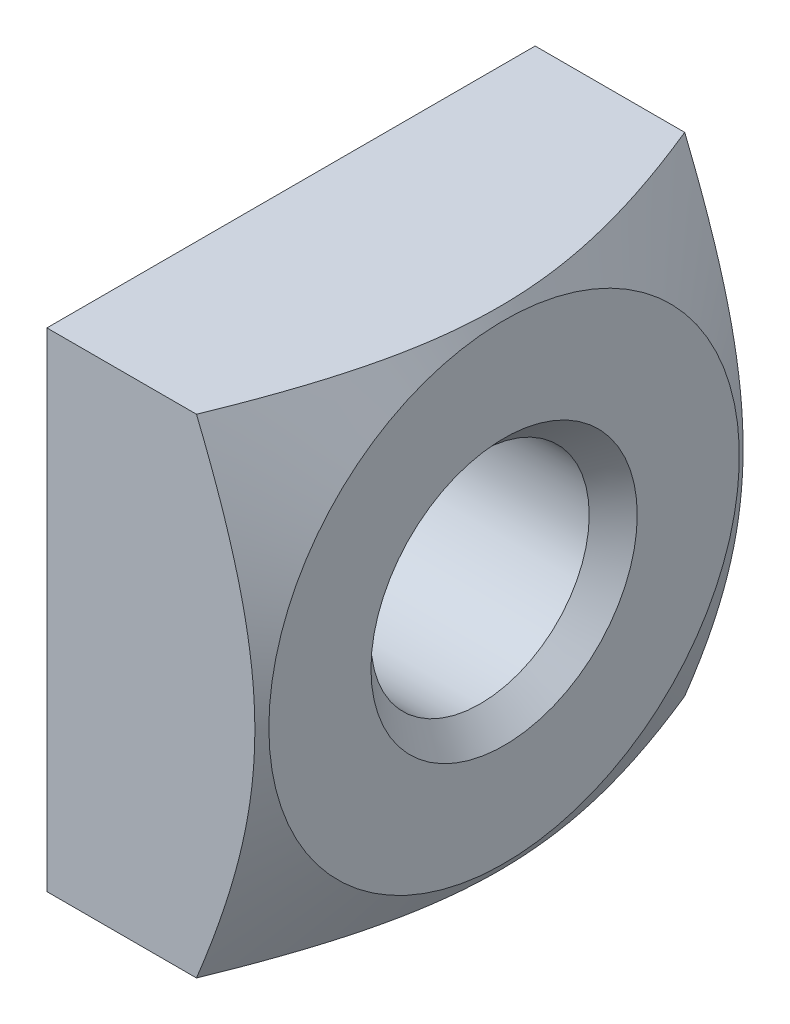
ISO-10303-21;
HEADER;
FILE_DESCRIPTION(('STEP AP214'),'2;1');
FILE_NAME('part.step','',(''),(''),'','','');
FILE_SCHEMA(('AUTOMOTIVE_DESIGN { 1 0 10303 214 1 1 1 1 }'));
ENDSEC;
DATA;
#1=APPLICATION_CONTEXT('core data for automotive mechanical design processes');
#2=APPLICATION_PROTOCOL_DEFINITION('international standard','automotive_design',2000,#1);
#3=PRODUCT_CONTEXT('',#1,'mechanical');
#4=PRODUCT('Part','Part','',(#3));
#5=PRODUCT_RELATED_PRODUCT_CATEGORY('part','',(#4));
#6=PRODUCT_DEFINITION_FORMATION('','',#4);
#7=PRODUCT_DEFINITION_CONTEXT('part definition',#1,'design');
#8=PRODUCT_DEFINITION('design','',#6,#7);
#9=PRODUCT_DEFINITION_SHAPE('','',#8);
#10=(LENGTH_UNIT() NAMED_UNIT(*) SI_UNIT(.MILLI.,.METRE.));
#11=(NAMED_UNIT(*) PLANE_ANGLE_UNIT() SI_UNIT($,.RADIAN.));
#12=(NAMED_UNIT(*) SI_UNIT($,.STERADIAN.) SOLID_ANGLE_UNIT());
#13=UNCERTAINTY_MEASURE_WITH_UNIT(LENGTH_MEASURE(1.E-05),#10,'distance_accuracy_value','');
#14=(GEOMETRIC_REPRESENTATION_CONTEXT(3) GLOBAL_UNCERTAINTY_ASSIGNED_CONTEXT((#13)) GLOBAL_UNIT_ASSIGNED_CONTEXT((#10,
#11,#12)) REPRESENTATION_CONTEXT('',''));
#15=CARTESIAN_POINT('',(0.,0.,0.));
#16=DIRECTION('',(0.,0.,1.));
#17=DIRECTION('',(1.,0.,0.));
#18=AXIS2_PLACEMENT_3D('',#15,#16,#17);
#19=CARTESIAN_POINT('',(2.4,2.65,0.));
#20=DIRECTION('',(-1.,0.,0.));
#21=DIRECTION('',(0.,0.,1.));
#22=AXIS2_PLACEMENT_3D('',#19,#20,#21);
#23=PLANE('',#22);
#24=CARTESIAN_POINT('',(2.4,0.,0.));
#25=DIRECTION('',(-1.,0.,0.));
#26=DIRECTION('',(0.,0.,1.));
#27=AXIS2_PLACEMENT_3D('',#24,#25,#26);
#28=CIRCLE('',#27,2.65);
#29=CARTESIAN_POINT('',(2.4,0.,2.65));
#30=VERTEX_POINT('',#29);
#31=EDGE_CURVE('E87',#30,#30,#28,.T.);
#32=ORIENTED_EDGE('',*,*,#31,.F.);
#33=EDGE_LOOP('',(#32));
#34=FACE_BOUND('',#33,.T.);
#35=CARTESIAN_POINT('',(2.4,0.,0.));
#36=DIRECTION('',(-1.,0.,0.));
#37=DIRECTION('',(0.,0.,1.));
#38=AXIS2_PLACEMENT_3D('',#35,#36,#37);
#39=CIRCLE('',#38,1.5);
#40=CARTESIAN_POINT('',(2.4,0.,1.5));
#41=VERTEX_POINT('',#40);
#42=EDGE_CURVE('E151',#41,#41,#39,.T.);
#43=ORIENTED_EDGE('',*,*,#42,.T.);
#44=EDGE_LOOP('',(#43));
#45=FACE_BOUND('',#44,.T.);
#46=ADVANCED_FACE('F33',(#34,#45),#23,.F.);
#47=CARTESIAN_POINT('',(0.,0.,0.));
#48=DIRECTION('',(1.,0.,0.));
#49=DIRECTION('',(0.,0.,-1.));
#50=AXIS2_PLACEMENT_3D('',#47,#48,#49);
#51=PLANE('',#50);
#52=DIRECTION('',(0.,-1.,0.));
#53=VECTOR('',#52,1.);
#54=CARTESIAN_POINT('',(0.,2.75,2.75));
#55=LINE('',#54,#53);
#56=CARTESIAN_POINT('',(0.,2.75,2.75));
#57=VERTEX_POINT('',#56);
#58=CARTESIAN_POINT('',(0.,-2.75,2.75));
#59=VERTEX_POINT('',#58);
#60=EDGE_CURVE('E84',#57,#59,#55,.T.);
#61=ORIENTED_EDGE('',*,*,#60,.F.);
#62=DIRECTION('',(0.,0.,1.));
#63=VECTOR('',#62,1.);
#64=CARTESIAN_POINT('',(0.,2.75,-2.75));
#65=LINE('',#64,#63);
#66=CARTESIAN_POINT('',(0.,2.75,-2.75));
#67=VERTEX_POINT('',#66);
#68=EDGE_CURVE('E91',#67,#57,#65,.T.);
#69=ORIENTED_EDGE('',*,*,#68,.F.);
#70=DIRECTION('',(0.,1.,0.));
#71=VECTOR('',#70,1.);
#72=CARTESIAN_POINT('',(0.,-2.75,-2.75));
#73=LINE('',#72,#71);
#74=CARTESIAN_POINT('',(0.,-2.75,-2.75));
#75=VERTEX_POINT('',#74);
#76=EDGE_CURVE('E99',#75,#67,#73,.T.);
#77=ORIENTED_EDGE('',*,*,#76,.F.);
#78=DIRECTION('',(0.,0.,-1.));
#79=VECTOR('',#78,1.);
#80=CARTESIAN_POINT('',(0.,-2.75,2.75));
#81=LINE('',#80,#79);
#82=EDGE_CURVE('E52',#59,#75,#81,.T.);
#83=ORIENTED_EDGE('',*,*,#82,.F.);
#84=EDGE_LOOP('',(#61,#69,#77,#83));
#85=FACE_BOUND('',#84,.T.);
#86=CARTESIAN_POINT('',(0.,0.,0.));
#87=DIRECTION('',(-1.,0.,0.));
#88=DIRECTION('',(0.,0.,1.));
#89=AXIS2_PLACEMENT_3D('',#86,#87,#88);
#90=CIRCLE('',#89,1.5);
#91=CARTESIAN_POINT('',(0.,0.,1.5));
#92=VERTEX_POINT('',#91);
#93=EDGE_CURVE('E95',#92,#92,#90,.T.);
#94=ORIENTED_EDGE('',*,*,#93,.F.);
#95=EDGE_LOOP('',(#94));
#96=FACE_BOUND('',#95,.T.);
#97=ADVANCED_FACE('F35',(#85,#96),#51,.F.);
#98=CARTESIAN_POINT('',(2.4,0.,0.));
#99=DIRECTION('',(-1.,0.,0.));
#100=DIRECTION('',(0.,0.,1.));
#101=AXIS2_PLACEMENT_3D('',#98,#99,#100);
#102=CONICAL_SURFACE('',#101,2.65,1.04719755119662);
#103=CARTESIAN_POINT('',(0.437416403055454,-5.38808537388172,-2.75));
#104=CARTESIAN_POINT('',(0.505632143891159,-5.25541159197081,-2.75));
#105=CARTESIAN_POINT('',(0.573453461779533,-5.12253295749888,-2.75));
#106=CARTESIAN_POINT('',(0.708096214056448,-4.85625986272506,-2.75));
#107=CARTESIAN_POINT('',(0.774917585008944,-4.72286537036732,-2.75));
#108=CARTESIAN_POINT('',(0.907500859792786,-4.45514784192819,-2.75));
#109=CARTESIAN_POINT('',(0.973259810571052,-4.32082334043091,-2.75));
#110=CARTESIAN_POINT('',(1.10324958936328,-4.05143910973717,-2.75));
#111=CARTESIAN_POINT('',(1.16748044967093,-3.91637939615247,-2.75));
#112=CARTESIAN_POINT('',(1.29750550621058,-3.63790013300568,-2.75));
#113=CARTESIAN_POINT('',(1.36319109035207,-3.49442969921591,-2.75));
#114=CARTESIAN_POINT('',(1.49179514662202,-3.20625532550067,-2.75));
#115=CARTESIAN_POINT('',(1.55471372276137,-3.06155143218505,-2.75));
#116=CARTESIAN_POINT('',(1.67686851691062,-2.77073309783559,-2.75));
#117=CARTESIAN_POINT('',(1.73610784288296,-2.62461997117271,-2.75));
#118=CARTESIAN_POINT('',(1.84975693489482,-2.33053676406858,-2.75));
#119=CARTESIAN_POINT('',(1.90416735328264,-2.18256693754529,-2.75));
#120=CARTESIAN_POINT('',(2.00596545645127,-1.88601039374014,-2.75));
#121=CARTESIAN_POINT('',(2.05342386975733,-1.73744840791392,-2.75));
#122=CARTESIAN_POINT('',(2.11827419079946,-1.51278051179147,-2.75));
#123=CARTESIAN_POINT('',(2.13883441206025,-1.43758853019003,-2.75));
#124=CARTESIAN_POINT('',(2.17753756373119,-1.28655762717232,-2.75));
#125=CARTESIAN_POINT('',(2.19567963950927,-1.21071848705717,-2.75));
#126=CARTESIAN_POINT('',(2.24533241429907,-0.985210508325254,-2.75));
#127=CARTESIAN_POINT('',(2.27293118185924,-0.834645726610996,-2.75));
#128=CARTESIAN_POINT('',(2.31507962935898,-0.53169406208772,-2.75));
#129=CARTESIAN_POINT('',(2.32963462910368,-0.379307947815045,-2.75));
#130=CARTESIAN_POINT('',(2.34123496030579,-0.13494690316544,-2.75));
#131=CARTESIAN_POINT('',(2.34295425314226,-0.0431776929021778,-2.75));
#132=CARTESIAN_POINT('',(2.34108060400825,0.14030364395211,-2.75));
#133=CARTESIAN_POINT('',(2.33748809855552,0.232015774614266,-2.75));
#134=CARTESIAN_POINT('',(2.32513752294774,0.415110830618787,-2.75));
#135=CARTESIAN_POINT('',(2.31637804124029,0.506493659133811,-2.75));
#136=CARTESIAN_POINT('',(2.29404456762574,0.688667459824817,-2.75));
#137=CARTESIAN_POINT('',(2.28047030004528,0.77945839780858,-2.75));
#138=CARTESIAN_POINT('',(2.24856054899789,0.962724508580117,-2.75));
#139=CARTESIAN_POINT('',(2.23010616720754,1.05517877608576,-2.75));
#140=CARTESIAN_POINT('',(2.18920401152235,1.23919255640873,-2.75));
#141=CARTESIAN_POINT('',(2.16675617303849,1.33075205472906,-2.75));
#142=CARTESIAN_POINT('',(2.11843300976784,1.51299240426342,-2.75));
#143=CARTESIAN_POINT('',(2.09255639480035,1.60367291087832,-2.75));
#144=CARTESIAN_POINT('',(2.0379088684679,1.78414541620499,-2.75));
#145=CARTESIAN_POINT('',(2.00913812154588,1.87393746508036,-2.75));
#146=CARTESIAN_POINT('',(1.92235698964403,2.13264631611484,-2.75));
#147=CARTESIAN_POINT('',(1.8612080357348,2.30050975377942,-2.75));
#148=CARTESIAN_POINT('',(1.73268409429066,2.63385076598241,-2.75));
#149=CARTESIAN_POINT('',(1.66530727663687,2.79932762258047,-2.75));
#150=CARTESIAN_POINT('',(1.52597938856516,3.12852460374905,-2.75));
#151=CARTESIAN_POINT('',(1.45402390241538,3.29224284888837,-2.75));
#152=CARTESIAN_POINT('',(1.30679720906668,3.61815098161288,-2.75));
#153=CARTESIAN_POINT('',(1.23152636886425,3.78034103596192,-2.75));
#154=CARTESIAN_POINT('',(1.07822784592911,4.10408880143019,-2.75));
#155=CARTESIAN_POINT('',(1.00019161157938,4.26564245008812,-2.75));
#156=CARTESIAN_POINT('',(0.842191787436758,4.58780633721145,-2.75));
#157=CARTESIAN_POINT('',(0.762228154206207,4.74841655431316,-2.75));
#158=CARTESIAN_POINT('',(0.520205449189572,5.22894464165323,-2.75));
#159=CARTESIAN_POINT('',(0.35592644903869,5.54774327678589,-2.75));
#160=CARTESIAN_POINT('',(0.04598624414216,6.14061157619431,-2.75));
#161=CARTESIAN_POINT('',(-0.0992059455244494,6.41492811784777,-2.75));
#162=CARTESIAN_POINT('',(-0.391616188124209,6.9625345600643,-2.75));
#163=CARTESIAN_POINT('',(-0.538834556964888,7.23582429188167,-2.75));
#164=CARTESIAN_POINT('',(-0.833704642081305,7.77973186206536,-2.75));
#165=CARTESIAN_POINT('',(-0.981346366331184,8.05035512835453,-2.75));
#166=CARTESIAN_POINT('',(-1.2777055138227,8.59094852922867,-2.75));
#167=CARTESIAN_POINT('',(-1.4264227372717,8.86091877328955,-2.75));
#168=CARTESIAN_POINT('',(-1.57552552771281,9.1306743633019,-2.75));
#169=B_SPLINE_CURVE_WITH_KNOTS('',3,(#103,#104,#105,#106,#107,#108,#109,#110,#111,#112,#113,
#114,#115,#116,#117,#118,#119,#120,#121,#122,#123,#124,#125,#126,#127,#128,#129,#130,#131,#132,
#133,#134,#135,#136,#137,#138,#139,#140,#141,#142,#143,#144,#145,#146,#147,#148,#149,#150,#151,
#152,#153,#154,#155,#156,#157,#158,#159,#160,#161,#162,#163,#164,#165,#166,#167,#168),
.UNSPECIFIED.,.F.,.F.,(4,2,2,2,2,2,2,2,2,2,2,2,2,2,2,2,2,2,2,2,2,2,2,2,2,2,2,2,2,2,2,2,4),(0.,
0.447552594613201,0.895133462351489,1.34379676691492,1.792450581277,2.2658045758501,
2.73914076197237,3.21207151191024,3.68493827497786,4.15259846123942,4.38641952174626,
4.62032300247546,5.07905765833717,5.53760513737404,5.81282004389318,6.08801233481039,
6.36327983961322,6.63856310756212,6.92129550601798,7.20403247772209,7.48687614147976,
7.76970374328904,8.30546900140096,8.84139220297657,9.37784032853619,9.91422921993717,
10.4524534258937,10.9906897731385,12.0665523531479,12.9976584090078,13.9289113189696,
14.8537412810219,15.77840364063),.UNSPECIFIED.);
#170=CARTESIAN_POINT('',(1.68461261580129,-2.75,-2.75));
#171=VERTEX_POINT('',#170);
#172=CARTESIAN_POINT('',(1.68461261580129,2.75,-2.75));
#173=VERTEX_POINT('',#172);
#174=EDGE_CURVE('E110',#171,#173,#169,.T.);
#175=ORIENTED_EDGE('',*,*,#174,.T.);
#176=CARTESIAN_POINT('',(0.437416403055454,2.75,-5.38808537388172));
#177=CARTESIAN_POINT('',(0.505632143891159,2.75,-5.25541159197081));
#178=CARTESIAN_POINT('',(0.573453461779533,2.75,-5.12253295749888));
#179=CARTESIAN_POINT('',(0.708096214056448,2.75,-4.85625986272506));
#180=CARTESIAN_POINT('',(0.774917585008944,2.75,-4.72286537036732));
#181=CARTESIAN_POINT('',(0.907500859792786,2.75,-4.45514784192819));
#182=CARTESIAN_POINT('',(0.973259810571052,2.75,-4.32082334043091));
#183=CARTESIAN_POINT('',(1.10324958936328,2.75,-4.05143910973717));
#184=CARTESIAN_POINT('',(1.16748044967093,2.75,-3.91637939615247));
#185=CARTESIAN_POINT('',(1.29750550621058,2.75,-3.63790013300568));
#186=CARTESIAN_POINT('',(1.36319109035207,2.75,-3.49442969921591));
#187=CARTESIAN_POINT('',(1.49179514662202,2.75,-3.20625532550067));
#188=CARTESIAN_POINT('',(1.55471372276137,2.75,-3.06155143218505));
#189=CARTESIAN_POINT('',(1.67686851691062,2.75,-2.77073309783559));
#190=CARTESIAN_POINT('',(1.73610784288296,2.75,-2.62461997117271));
#191=CARTESIAN_POINT('',(1.84975693489482,2.75,-2.33053676406858));
#192=CARTESIAN_POINT('',(1.90416735328264,2.75,-2.18256693754529));
#193=CARTESIAN_POINT('',(2.00596545645127,2.75,-1.88601039374014));
#194=CARTESIAN_POINT('',(2.05342386975733,2.75,-1.73744840791392));
#195=CARTESIAN_POINT('',(2.11827419079946,2.75,-1.51278051179147));
#196=CARTESIAN_POINT('',(2.13883441206025,2.75,-1.43758853019003));
#197=CARTESIAN_POINT('',(2.17753756373119,2.75,-1.28655762717232));
#198=CARTESIAN_POINT('',(2.19567963950927,2.75,-1.21071848705717));
#199=CARTESIAN_POINT('',(2.24533241429907,2.75,-0.985210508325254));
#200=CARTESIAN_POINT('',(2.27293118185924,2.75,-0.834645726610996));
#201=CARTESIAN_POINT('',(2.31507962935898,2.75,-0.53169406208772));
#202=CARTESIAN_POINT('',(2.32963462910368,2.75,-0.379307947815045));
#203=CARTESIAN_POINT('',(2.34123496030579,2.75,-0.13494690316544));
#204=CARTESIAN_POINT('',(2.34295425314226,2.75,-0.0431776929021778));
#205=CARTESIAN_POINT('',(2.34108060400825,2.75,0.14030364395211));
#206=CARTESIAN_POINT('',(2.33748809855552,2.75,0.232015774614266));
#207=CARTESIAN_POINT('',(2.32513752294774,2.75,0.415110830618787));
#208=CARTESIAN_POINT('',(2.31637804124029,2.75,0.506493659133811));
#209=CARTESIAN_POINT('',(2.29404456762574,2.75,0.688667459824817));
#210=CARTESIAN_POINT('',(2.28047030004528,2.75,0.77945839780858));
#211=CARTESIAN_POINT('',(2.24856054899789,2.75,0.962724508580117));
#212=CARTESIAN_POINT('',(2.23010616720754,2.75,1.05517877608576));
#213=CARTESIAN_POINT('',(2.18920401152235,2.75,1.23919255640873));
#214=CARTESIAN_POINT('',(2.16675617303849,2.75,1.33075205472906));
#215=CARTESIAN_POINT('',(2.11843300976784,2.75,1.51299240426342));
#216=CARTESIAN_POINT('',(2.09255639480035,2.75,1.60367291087832));
#217=CARTESIAN_POINT('',(2.0379088684679,2.75,1.78414541620499));
#218=CARTESIAN_POINT('',(2.00913812154588,2.75,1.87393746508036));
#219=CARTESIAN_POINT('',(1.92235698964403,2.75,2.13264631611484));
#220=CARTESIAN_POINT('',(1.8612080357348,2.75,2.30050975377942));
#221=CARTESIAN_POINT('',(1.73268409429066,2.75,2.63385076598241));
#222=CARTESIAN_POINT('',(1.66530727663687,2.75,2.79932762258047));
#223=CARTESIAN_POINT('',(1.52597938856516,2.75,3.12852460374905));
#224=CARTESIAN_POINT('',(1.45402390241538,2.75,3.29224284888837));
#225=CARTESIAN_POINT('',(1.30679720906668,2.75,3.61815098161288));
#226=CARTESIAN_POINT('',(1.23152636886425,2.75,3.78034103596192));
#227=CARTESIAN_POINT('',(1.07822784592911,2.75,4.10408880143019));
#228=CARTESIAN_POINT('',(1.00019161157938,2.75,4.26564245008812));
#229=CARTESIAN_POINT('',(0.842191787436758,2.75,4.58780633721145));
#230=CARTESIAN_POINT('',(0.762228154206207,2.75,4.74841655431316));
#231=CARTESIAN_POINT('',(0.520205449189572,2.75,5.22894464165323));
#232=CARTESIAN_POINT('',(0.35592644903869,2.75,5.54774327678589));
#233=CARTESIAN_POINT('',(0.04598624414216,2.75,6.14061157619431));
#234=CARTESIAN_POINT('',(-0.0992059455244494,2.75,6.41492811784777));
#235=CARTESIAN_POINT('',(-0.391616188124209,2.75,6.9625345600643));
#236=CARTESIAN_POINT('',(-0.538834556964888,2.75,7.23582429188167));
#237=CARTESIAN_POINT('',(-0.833704642081305,2.75,7.77973186206536));
#238=CARTESIAN_POINT('',(-0.981346366331184,2.75,8.05035512835453));
#239=CARTESIAN_POINT('',(-1.2777055138227,2.75,8.59094852922867));
#240=CARTESIAN_POINT('',(-1.4264227372717,2.75,8.86091877328955));
#241=CARTESIAN_POINT('',(-1.57552552771281,2.75,9.1306743633019));
#242=B_SPLINE_CURVE_WITH_KNOTS('',3,(#176,#177,#178,#179,#180,#181,#182,#183,#184,#185,#186,
#187,#188,#189,#190,#191,#192,#193,#194,#195,#196,#197,#198,#199,#200,#201,#202,#203,#204,#205,
#206,#207,#208,#209,#210,#211,#212,#213,#214,#215,#216,#217,#218,#219,#220,#221,#222,#223,#224,
#225,#226,#227,#228,#229,#230,#231,#232,#233,#234,#235,#236,#237,#238,#239,#240,#241),
.UNSPECIFIED.,.F.,.F.,(4,2,2,2,2,2,2,2,2,2,2,2,2,2,2,2,2,2,2,2,2,2,2,2,2,2,2,2,2,2,2,2,4),(0.,
0.447552594613201,0.895133462351489,1.34379676691492,1.792450581277,2.2658045758501,
2.73914076197237,3.21207151191024,3.68493827497786,4.15259846123942,4.38641952174626,
4.62032300247546,5.07905765833717,5.53760513737404,5.81282004389318,6.08801233481039,
6.36327983961322,6.63856310756212,6.92129550601798,7.20403247772209,7.48687614147976,
7.76970374328904,8.30546900140096,8.84139220297657,9.37784032853619,9.91422921993717,
10.4524534258937,10.9906897731385,12.0665523531479,12.9976584090078,13.9289113189696,
14.8537412810219,15.77840364063),.UNSPECIFIED.);
#243=CARTESIAN_POINT('',(1.68461261580129,2.75,2.75));
#244=VERTEX_POINT('',#243);
#245=EDGE_CURVE('E11',#173,#244,#242,.T.);
#246=ORIENTED_EDGE('',*,*,#245,.T.);
#247=CARTESIAN_POINT('',(0.437416403055454,-5.38808537388172,2.75));
#248=CARTESIAN_POINT('',(0.505632143891159,-5.25541159197081,2.75));
#249=CARTESIAN_POINT('',(0.573453461779533,-5.12253295749888,2.75));
#250=CARTESIAN_POINT('',(0.708096214056448,-4.85625986272506,2.75));
#251=CARTESIAN_POINT('',(0.774917585008944,-4.72286537036732,2.75));
#252=CARTESIAN_POINT('',(0.907500859792786,-4.45514784192819,2.75));
#253=CARTESIAN_POINT('',(0.973259810571052,-4.32082334043091,2.75));
#254=CARTESIAN_POINT('',(1.10324958936328,-4.05143910973717,2.75));
#255=CARTESIAN_POINT('',(1.16748044967093,-3.91637939615247,2.75));
#256=CARTESIAN_POINT('',(1.29750550621058,-3.63790013300568,2.75));
#257=CARTESIAN_POINT('',(1.36319109035207,-3.49442969921591,2.75));
#258=CARTESIAN_POINT('',(1.49179514662202,-3.20625532550067,2.75));
#259=CARTESIAN_POINT('',(1.55471372276137,-3.06155143218505,2.75));
#260=CARTESIAN_POINT('',(1.67686851691062,-2.77073309783559,2.75));
#261=CARTESIAN_POINT('',(1.73610784288296,-2.62461997117271,2.75));
#262=CARTESIAN_POINT('',(1.84975693489482,-2.33053676406858,2.75));
#263=CARTESIAN_POINT('',(1.90416735328264,-2.18256693754529,2.75));
#264=CARTESIAN_POINT('',(2.00596545645127,-1.88601039374014,2.75));
#265=CARTESIAN_POINT('',(2.05342386975733,-1.73744840791392,2.75));
#266=CARTESIAN_POINT('',(2.11827419079946,-1.51278051179147,2.75));
#267=CARTESIAN_POINT('',(2.13883441206025,-1.43758853019003,2.75));
#268=CARTESIAN_POINT('',(2.17753756373119,-1.28655762717232,2.75));
#269=CARTESIAN_POINT('',(2.19567963950927,-1.21071848705717,2.75));
#270=CARTESIAN_POINT('',(2.24533241429907,-0.985210508325254,2.75));
#271=CARTESIAN_POINT('',(2.27293118185924,-0.834645726610996,2.75));
#272=CARTESIAN_POINT('',(2.31507962935898,-0.53169406208772,2.75));
#273=CARTESIAN_POINT('',(2.32963462910368,-0.379307947815045,2.75));
#274=CARTESIAN_POINT('',(2.34123496030579,-0.13494690316544,2.75));
#275=CARTESIAN_POINT('',(2.34295425314226,-0.0431776929021778,2.75));
#276=CARTESIAN_POINT('',(2.34108060400825,0.14030364395211,2.75));
#277=CARTESIAN_POINT('',(2.33748809855552,0.232015774614266,2.75));
#278=CARTESIAN_POINT('',(2.32513752294774,0.415110830618787,2.75));
#279=CARTESIAN_POINT('',(2.31637804124029,0.506493659133811,2.75));
#280=CARTESIAN_POINT('',(2.29404456762574,0.688667459824817,2.75));
#281=CARTESIAN_POINT('',(2.28047030004528,0.77945839780858,2.75));
#282=CARTESIAN_POINT('',(2.24856054899789,0.962724508580117,2.75));
#283=CARTESIAN_POINT('',(2.23010616720754,1.05517877608576,2.75));
#284=CARTESIAN_POINT('',(2.18920401152235,1.23919255640873,2.75));
#285=CARTESIAN_POINT('',(2.16675617303849,1.33075205472906,2.75));
#286=CARTESIAN_POINT('',(2.11843300976784,1.51299240426342,2.75));
#287=CARTESIAN_POINT('',(2.09255639480035,1.60367291087832,2.75));
#288=CARTESIAN_POINT('',(2.0379088684679,1.78414541620499,2.75));
#289=CARTESIAN_POINT('',(2.00913812154588,1.87393746508036,2.75));
#290=CARTESIAN_POINT('',(1.92235698964403,2.13264631611484,2.75));
#291=CARTESIAN_POINT('',(1.8612080357348,2.30050975377942,2.75));
#292=CARTESIAN_POINT('',(1.73268409429066,2.63385076598241,2.75));
#293=CARTESIAN_POINT('',(1.66530727663687,2.79932762258047,2.75));
#294=CARTESIAN_POINT('',(1.52597938856516,3.12852460374905,2.75));
#295=CARTESIAN_POINT('',(1.45402390241538,3.29224284888837,2.75));
#296=CARTESIAN_POINT('',(1.30679720906668,3.61815098161288,2.75));
#297=CARTESIAN_POINT('',(1.23152636886425,3.78034103596192,2.75));
#298=CARTESIAN_POINT('',(1.07822784592911,4.10408880143019,2.75));
#299=CARTESIAN_POINT('',(1.00019161157938,4.26564245008812,2.75));
#300=CARTESIAN_POINT('',(0.842191787436758,4.58780633721145,2.75));
#301=CARTESIAN_POINT('',(0.762228154206207,4.74841655431316,2.75));
#302=CARTESIAN_POINT('',(0.520205449189572,5.22894464165323,2.75));
#303=CARTESIAN_POINT('',(0.35592644903869,5.54774327678589,2.75));
#304=CARTESIAN_POINT('',(0.04598624414216,6.14061157619431,2.75));
#305=CARTESIAN_POINT('',(-0.0992059455244494,6.41492811784777,2.75));
#306=CARTESIAN_POINT('',(-0.391616188124209,6.9625345600643,2.75));
#307=CARTESIAN_POINT('',(-0.538834556964888,7.23582429188167,2.75));
#308=CARTESIAN_POINT('',(-0.833704642081305,7.77973186206536,2.75));
#309=CARTESIAN_POINT('',(-0.981346366331184,8.05035512835453,2.75));
#310=CARTESIAN_POINT('',(-1.2777055138227,8.59094852922867,2.75));
#311=CARTESIAN_POINT('',(-1.4264227372717,8.86091877328955,2.75));
#312=CARTESIAN_POINT('',(-1.57552552771281,9.1306743633019,2.75));
#313=B_SPLINE_CURVE_WITH_KNOTS('',3,(#247,#248,#249,#250,#251,#252,#253,#254,#255,#256,#257,
#258,#259,#260,#261,#262,#263,#264,#265,#266,#267,#268,#269,#270,#271,#272,#273,#274,#275,#276,
#277,#278,#279,#280,#281,#282,#283,#284,#285,#286,#287,#288,#289,#290,#291,#292,#293,#294,#295,
#296,#297,#298,#299,#300,#301,#302,#303,#304,#305,#306,#307,#308,#309,#310,#311,#312),
.UNSPECIFIED.,.F.,.F.,(4,2,2,2,2,2,2,2,2,2,2,2,2,2,2,2,2,2,2,2,2,2,2,2,2,2,2,2,2,2,2,2,4),(0.,
0.447552594613201,0.895133462351489,1.34379676691492,1.792450581277,2.2658045758501,
2.73914076197237,3.21207151191024,3.68493827497786,4.15259846123942,4.38641952174626,
4.62032300247546,5.07905765833717,5.53760513737404,5.81282004389318,6.08801233481039,
6.36327983961322,6.63856310756212,6.92129550601798,7.20403247772209,7.48687614147976,
7.76970374328904,8.30546900140096,8.84139220297657,9.37784032853619,9.91422921993717,
10.4524534258937,10.9906897731385,12.0665523531479,12.9976584090078,13.9289113189696,
14.8537412810219,15.77840364063),.UNSPECIFIED.);
#314=CARTESIAN_POINT('',(1.68461261580129,-2.75,2.75));
#315=VERTEX_POINT('',#314);
#316=EDGE_CURVE('E45',#244,#315,#313,.F.);
#317=ORIENTED_EDGE('',*,*,#316,.T.);
#318=CARTESIAN_POINT('',(0.437416403055454,-2.75,-5.38808537388172));
#319=CARTESIAN_POINT('',(0.505632143891159,-2.75,-5.25541159197081));
#320=CARTESIAN_POINT('',(0.573453461779533,-2.75,-5.12253295749888));
#321=CARTESIAN_POINT('',(0.708096214056448,-2.75,-4.85625986272506));
#322=CARTESIAN_POINT('',(0.774917585008944,-2.75,-4.72286537036732));
#323=CARTESIAN_POINT('',(0.907500859792786,-2.75,-4.45514784192819));
#324=CARTESIAN_POINT('',(0.973259810571052,-2.75,-4.32082334043091));
#325=CARTESIAN_POINT('',(1.10324958936328,-2.75,-4.05143910973717));
#326=CARTESIAN_POINT('',(1.16748044967093,-2.75,-3.91637939615247));
#327=CARTESIAN_POINT('',(1.29750550621058,-2.75,-3.63790013300568));
#328=CARTESIAN_POINT('',(1.36319109035207,-2.75,-3.49442969921591));
#329=CARTESIAN_POINT('',(1.49179514662202,-2.75,-3.20625532550067));
#330=CARTESIAN_POINT('',(1.55471372276137,-2.75,-3.06155143218505));
#331=CARTESIAN_POINT('',(1.67686851691062,-2.75,-2.77073309783559));
#332=CARTESIAN_POINT('',(1.73610784288296,-2.75,-2.62461997117271));
#333=CARTESIAN_POINT('',(1.84975693489482,-2.75,-2.33053676406858));
#334=CARTESIAN_POINT('',(1.90416735328264,-2.75,-2.18256693754529));
#335=CARTESIAN_POINT('',(2.00596545645127,-2.75,-1.88601039374014));
#336=CARTESIAN_POINT('',(2.05342386975733,-2.75,-1.73744840791392));
#337=CARTESIAN_POINT('',(2.11827419079946,-2.75,-1.51278051179147));
#338=CARTESIAN_POINT('',(2.13883441206025,-2.75,-1.43758853019003));
#339=CARTESIAN_POINT('',(2.17753756373119,-2.75,-1.28655762717232));
#340=CARTESIAN_POINT('',(2.19567963950927,-2.75,-1.21071848705717));
#341=CARTESIAN_POINT('',(2.24533241429907,-2.75,-0.985210508325254));
#342=CARTESIAN_POINT('',(2.27293118185924,-2.75,-0.834645726610996));
#343=CARTESIAN_POINT('',(2.31507962935898,-2.75,-0.53169406208772));
#344=CARTESIAN_POINT('',(2.32963462910368,-2.75,-0.379307947815045));
#345=CARTESIAN_POINT('',(2.34123496030579,-2.75,-0.13494690316544));
#346=CARTESIAN_POINT('',(2.34295425314226,-2.75,-0.0431776929021778));
#347=CARTESIAN_POINT('',(2.34108060400825,-2.75,0.14030364395211));
#348=CARTESIAN_POINT('',(2.33748809855552,-2.75,0.232015774614266));
#349=CARTESIAN_POINT('',(2.32513752294774,-2.75,0.415110830618787));
#350=CARTESIAN_POINT('',(2.31637804124029,-2.75,0.506493659133811));
#351=CARTESIAN_POINT('',(2.29404456762574,-2.75,0.688667459824817));
#352=CARTESIAN_POINT('',(2.28047030004528,-2.75,0.77945839780858));
#353=CARTESIAN_POINT('',(2.24856054899789,-2.75,0.962724508580117));
#354=CARTESIAN_POINT('',(2.23010616720754,-2.75,1.05517877608576));
#355=CARTESIAN_POINT('',(2.18920401152235,-2.75,1.23919255640873));
#356=CARTESIAN_POINT('',(2.16675617303849,-2.75,1.33075205472906));
#357=CARTESIAN_POINT('',(2.11843300976784,-2.75,1.51299240426342));
#358=CARTESIAN_POINT('',(2.09255639480035,-2.75,1.60367291087832));
#359=CARTESIAN_POINT('',(2.0379088684679,-2.75,1.78414541620499));
#360=CARTESIAN_POINT('',(2.00913812154588,-2.75,1.87393746508036));
#361=CARTESIAN_POINT('',(1.92235698964403,-2.75,2.13264631611484));
#362=CARTESIAN_POINT('',(1.8612080357348,-2.75,2.30050975377942));
#363=CARTESIAN_POINT('',(1.73268409429066,-2.75,2.63385076598241));
#364=CARTESIAN_POINT('',(1.66530727663687,-2.75,2.79932762258047));
#365=CARTESIAN_POINT('',(1.52597938856516,-2.75,3.12852460374905));
#366=CARTESIAN_POINT('',(1.45402390241538,-2.75,3.29224284888837));
#367=CARTESIAN_POINT('',(1.30679720906668,-2.75,3.61815098161288));
#368=CARTESIAN_POINT('',(1.23152636886425,-2.75,3.78034103596192));
#369=CARTESIAN_POINT('',(1.07822784592911,-2.75,4.10408880143019));
#370=CARTESIAN_POINT('',(1.00019161157938,-2.75,4.26564245008812));
#371=CARTESIAN_POINT('',(0.842191787436758,-2.75,4.58780633721145));
#372=CARTESIAN_POINT('',(0.762228154206207,-2.75,4.74841655431316));
#373=CARTESIAN_POINT('',(0.520205449189572,-2.75,5.22894464165323));
#374=CARTESIAN_POINT('',(0.35592644903869,-2.75,5.54774327678589));
#375=CARTESIAN_POINT('',(0.04598624414216,-2.75,6.14061157619431));
#376=CARTESIAN_POINT('',(-0.0992059455244494,-2.75,6.41492811784777));
#377=CARTESIAN_POINT('',(-0.391616188124209,-2.75,6.9625345600643));
#378=CARTESIAN_POINT('',(-0.538834556964888,-2.75,7.23582429188167));
#379=CARTESIAN_POINT('',(-0.833704642081305,-2.75,7.77973186206536));
#380=CARTESIAN_POINT('',(-0.981346366331184,-2.75,8.05035512835453));
#381=CARTESIAN_POINT('',(-1.2777055138227,-2.75,8.59094852922867));
#382=CARTESIAN_POINT('',(-1.4264227372717,-2.75,8.86091877328955));
#383=CARTESIAN_POINT('',(-1.57552552771281,-2.75,9.1306743633019));
#384=B_SPLINE_CURVE_WITH_KNOTS('',3,(#318,#319,#320,#321,#322,#323,#324,#325,#326,#327,#328,
#329,#330,#331,#332,#333,#334,#335,#336,#337,#338,#339,#340,#341,#342,#343,#344,#345,#346,#347,
#348,#349,#350,#351,#352,#353,#354,#355,#356,#357,#358,#359,#360,#361,#362,#363,#364,#365,#366,
#367,#368,#369,#370,#371,#372,#373,#374,#375,#376,#377,#378,#379,#380,#381,#382,#383),
.UNSPECIFIED.,.F.,.F.,(4,2,2,2,2,2,2,2,2,2,2,2,2,2,2,2,2,2,2,2,2,2,2,2,2,2,2,2,2,2,2,2,4),(0.,
0.447552594613201,0.895133462351489,1.34379676691492,1.792450581277,2.2658045758501,
2.73914076197237,3.21207151191024,3.68493827497786,4.15259846123942,4.38641952174626,
4.62032300247546,5.07905765833717,5.53760513737404,5.81282004389318,6.08801233481039,
6.36327983961322,6.63856310756212,6.92129550601798,7.20403247772209,7.48687614147976,
7.76970374328904,8.30546900140096,8.84139220297657,9.37784032853619,9.91422921993717,
10.4524534258937,10.9906897731385,12.0665523531479,12.9976584090078,13.9289113189696,
14.8537412810219,15.77840364063),.UNSPECIFIED.);
#385=EDGE_CURVE('E117',#315,#171,#384,.F.);
#386=ORIENTED_EDGE('',*,*,#385,.T.);
#387=EDGE_LOOP('',(#175,#246,#317,#386));
#388=FACE_BOUND('',#387,.T.);
#389=ORIENTED_EDGE('',*,*,#31,.T.);
#390=EDGE_LOOP('',(#389));
#391=FACE_BOUND('',#390,.T.);
#392=ADVANCED_FACE('F122',(#388,#391),#102,.T.);
#393=CARTESIAN_POINT('',(6.,2.75,-2.75));
#394=DIRECTION('',(0.,-1.,0.));
#395=DIRECTION('',(0.,0.,-1.));
#396=AXIS2_PLACEMENT_3D('',#393,#394,#395);
#397=PLANE('',#396);
#398=DIRECTION('',(-1.,0.,0.));
#399=VECTOR('',#398,1.);
#400=CARTESIAN_POINT('',(6.,2.75,-2.75));
#401=LINE('',#400,#399);
#402=EDGE_CURVE('E60',#173,#67,#401,.T.);
#403=ORIENTED_EDGE('',*,*,#402,.T.);
#404=ORIENTED_EDGE('',*,*,#68,.T.);
#405=DIRECTION('',(-1.,0.,0.));
#406=VECTOR('',#405,1.);
#407=CARTESIAN_POINT('',(6.,2.75,2.75));
#408=LINE('',#407,#406);
#409=EDGE_CURVE('E79',#244,#57,#408,.T.);
#410=ORIENTED_EDGE('',*,*,#409,.F.);
#411=ORIENTED_EDGE('',*,*,#245,.F.);
#412=EDGE_LOOP('',(#403,#404,#410,#411));
#413=FACE_BOUND('',#412,.T.);
#414=ADVANCED_FACE('F92',(#413),#397,.F.);
#415=CARTESIAN_POINT('',(6.,2.75,2.75));
#416=DIRECTION('',(0.,0.,-1.));
#417=DIRECTION('',(-1.,0.,0.));
#418=AXIS2_PLACEMENT_3D('',#415,#416,#417);
#419=PLANE('',#418);
#420=ORIENTED_EDGE('',*,*,#409,.T.);
#421=ORIENTED_EDGE('',*,*,#60,.T.);
#422=DIRECTION('',(-1.,0.,0.));
#423=VECTOR('',#422,1.);
#424=CARTESIAN_POINT('',(6.,-2.75,2.75));
#425=LINE('',#424,#423);
#426=EDGE_CURVE('E88',#315,#59,#425,.T.);
#427=ORIENTED_EDGE('',*,*,#426,.F.);
#428=ORIENTED_EDGE('',*,*,#316,.F.);
#429=EDGE_LOOP('',(#420,#421,#427,#428));
#430=FACE_BOUND('',#429,.T.);
#431=ADVANCED_FACE('F81',(#430),#419,.F.);
#432=CARTESIAN_POINT('',(6.,-2.75,2.75));
#433=DIRECTION('',(0.,1.,0.));
#434=DIRECTION('',(0.,0.,1.));
#435=AXIS2_PLACEMENT_3D('',#432,#433,#434);
#436=PLANE('',#435);
#437=ORIENTED_EDGE('',*,*,#426,.T.);
#438=ORIENTED_EDGE('',*,*,#82,.T.);
#439=DIRECTION('',(-1.,0.,0.));
#440=VECTOR('',#439,1.);
#441=CARTESIAN_POINT('',(6.,-2.75,-2.75));
#442=LINE('',#441,#440);
#443=EDGE_CURVE('E105',#171,#75,#442,.T.);
#444=ORIENTED_EDGE('',*,*,#443,.F.);
#445=ORIENTED_EDGE('',*,*,#385,.F.);
#446=EDGE_LOOP('',(#437,#438,#444,#445));
#447=FACE_BOUND('',#446,.T.);
#448=ADVANCED_FACE('F130',(#447),#436,.F.);
#449=CARTESIAN_POINT('',(6.,-2.75,-2.75));
#450=DIRECTION('',(0.,0.,1.));
#451=DIRECTION('',(1.,0.,0.));
#452=AXIS2_PLACEMENT_3D('',#449,#450,#451);
#453=PLANE('',#452);
#454=ORIENTED_EDGE('',*,*,#443,.T.);
#455=ORIENTED_EDGE('',*,*,#76,.T.);
#456=ORIENTED_EDGE('',*,*,#402,.F.);
#457=ORIENTED_EDGE('',*,*,#174,.F.);
#458=EDGE_LOOP('',(#454,#455,#456,#457));
#459=FACE_BOUND('',#458,.T.);
#460=ADVANCED_FACE('F125',(#459),#453,.F.);
#461=CARTESIAN_POINT('',(0.2705,0.,0.));
#462=DIRECTION('',(-1.,0.,0.));
#463=DIRECTION('',(0.,0.,1.));
#464=AXIS2_PLACEMENT_3D('',#461,#462,#463);
#465=CONICAL_SURFACE('',#464,1.2295,0.785398163397449);
#466=ORIENTED_EDGE('',*,*,#93,.T.);
#467=EDGE_LOOP('',(#466));
#468=FACE_BOUND('',#467,.T.);
#469=CARTESIAN_POINT('',(0.2705,0.,0.));
#470=DIRECTION('',(-1.,0.,0.));
#471=DIRECTION('',(0.,0.,1.));
#472=AXIS2_PLACEMENT_3D('',#469,#470,#471);
#473=CIRCLE('',#472,1.2295);
#474=CARTESIAN_POINT('',(0.2705,0.,1.2295));
#475=VERTEX_POINT('',#474);
#476=EDGE_CURVE('E156',#475,#475,#473,.T.);
#477=ORIENTED_EDGE('',*,*,#476,.F.);
#478=EDGE_LOOP('',(#477));
#479=FACE_BOUND('',#478,.T.);
#480=ADVANCED_FACE('F129',(#468,#479),#465,.F.);
#481=CARTESIAN_POINT('',(2.4,0.,0.));
#482=DIRECTION('',(-1.,0.,0.));
#483=DIRECTION('',(0.,0.,1.));
#484=AXIS2_PLACEMENT_3D('',#481,#482,#483);
#485=CYLINDRICAL_SURFACE('',#484,1.2295);
#486=ORIENTED_EDGE('',*,*,#476,.T.);
#487=EDGE_LOOP('',(#486));
#488=FACE_BOUND('',#487,.T.);
#489=CARTESIAN_POINT('',(2.1295,0.,0.));
#490=DIRECTION('',(-1.,0.,0.));
#491=DIRECTION('',(0.,0.,1.));
#492=AXIS2_PLACEMENT_3D('',#489,#490,#491);
#493=CIRCLE('',#492,1.2295);
#494=CARTESIAN_POINT('',(2.1295,0.,1.2295));
#495=VERTEX_POINT('',#494);
#496=EDGE_CURVE('E153',#495,#495,#493,.T.);
#497=ORIENTED_EDGE('',*,*,#496,.F.);
#498=EDGE_LOOP('',(#497));
#499=FACE_BOUND('',#498,.T.);
#500=ADVANCED_FACE('F196',(#488,#499),#485,.F.);
#501=CARTESIAN_POINT('',(2.4,0.,0.));
#502=DIRECTION('',(1.,0.,0.));
#503=DIRECTION('',(0.,0.,-1.));
#504=AXIS2_PLACEMENT_3D('',#501,#502,#503);
#505=CONICAL_SURFACE('',#504,1.5,0.785398163397449);
#506=ORIENTED_EDGE('',*,*,#496,.T.);
#507=EDGE_LOOP('',(#506));
#508=FACE_BOUND('',#507,.T.);
#509=ORIENTED_EDGE('',*,*,#42,.F.);
#510=EDGE_LOOP('',(#509));
#511=FACE_BOUND('',#510,.T.);
#512=ADVANCED_FACE('F202',(#508,#511),#505,.F.);
#513=CLOSED_SHELL('',(#46,#97,#392,#414,#431,#448,#460,#480,#500,#512));
#514=MANIFOLD_SOLID_BREP('B2',#513);
#515=ADVANCED_BREP_SHAPE_REPRESENTATION('',(#18,#514),#14);
#516=SHAPE_DEFINITION_REPRESENTATION(#9,#515);
ENDSEC;
END-ISO-10303-21;
